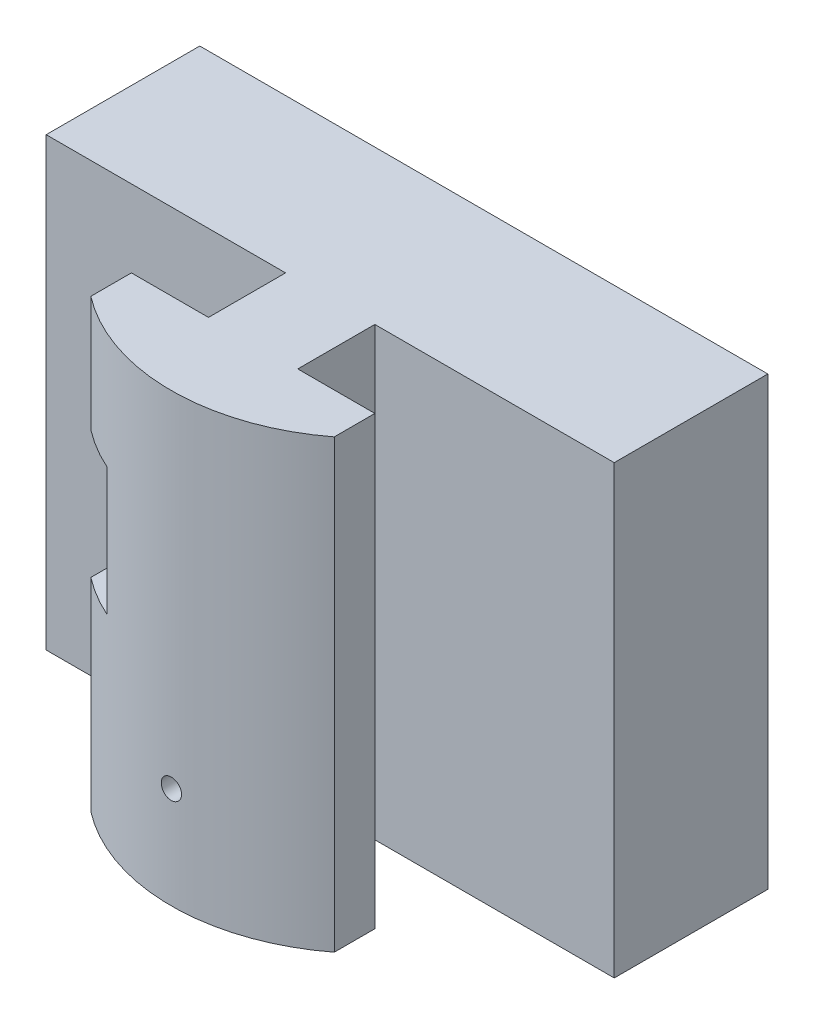
ISO-10303-21;
HEADER;
FILE_DESCRIPTION(('STEP AP214'),'2;1');
FILE_NAME('part.step','',(''),(''),'','','');
FILE_SCHEMA(('AUTOMOTIVE_DESIGN { 1 0 10303 214 1 1 1 1 }'));
ENDSEC;
DATA;
#1=APPLICATION_CONTEXT('core data for automotive mechanical design processes');
#2=APPLICATION_PROTOCOL_DEFINITION('international standard','automotive_design',2000,#1);
#3=PRODUCT_CONTEXT('',#1,'mechanical');
#4=PRODUCT('Part','Part','',(#3));
#5=PRODUCT_RELATED_PRODUCT_CATEGORY('part','',(#4));
#6=PRODUCT_DEFINITION_FORMATION('','',#4);
#7=PRODUCT_DEFINITION_CONTEXT('part definition',#1,'design');
#8=PRODUCT_DEFINITION('design','',#6,#7);
#9=PRODUCT_DEFINITION_SHAPE('','',#8);
#10=(LENGTH_UNIT() NAMED_UNIT(*) SI_UNIT(.MILLI.,.METRE.));
#11=(NAMED_UNIT(*) PLANE_ANGLE_UNIT() SI_UNIT($,.RADIAN.));
#12=(NAMED_UNIT(*) SI_UNIT($,.STERADIAN.) SOLID_ANGLE_UNIT());
#13=UNCERTAINTY_MEASURE_WITH_UNIT(LENGTH_MEASURE(1.E-05),#10,'distance_accuracy_value','');
#14=(GEOMETRIC_REPRESENTATION_CONTEXT(3) GLOBAL_UNCERTAINTY_ASSIGNED_CONTEXT((#13)) GLOBAL_UNIT_ASSIGNED_CONTEXT((#10,
#11,#12)) REPRESENTATION_CONTEXT('',''));
#15=CARTESIAN_POINT('',(0.,0.,0.));
#16=DIRECTION('',(0.,0.,1.));
#17=DIRECTION('',(1.,0.,0.));
#18=AXIS2_PLACEMENT_3D('',#15,#16,#17);
#19=CARTESIAN_POINT('',(116.22223,103.784958,0.));
#20=DIRECTION('',(0.,0.,-1.));
#21=DIRECTION('',(-1.,0.,0.));
#22=AXIS2_PLACEMENT_3D('',#19,#20,#21);
#23=CYLINDRICAL_SURFACE('',#22,0.5);
#24=CARTESIAN_POINT('',(116.22223,104.284958,15.411299780114));
#25=CARTESIAN_POINT('',(116.250295790881,104.284956761582,15.411299610234));
#26=CARTESIAN_POINT('',(116.278381470551,104.28258699731,15.4111784287618));
#27=CARTESIAN_POINT('',(116.333778003503,104.273167168658,15.4107066617587));
#28=CARTESIAN_POINT('',(116.36108790498,104.266111593697,15.4103558061345));
#29=CARTESIAN_POINT('',(116.414122395419,104.247522711383,15.4094644006496));
#30=CARTESIAN_POINT('',(116.43984778619,104.235991690673,15.4089239476735));
#31=CARTESIAN_POINT('',(116.488990869762,104.2087827651,15.407714210784));
#32=CARTESIAN_POINT('',(116.512409104595,104.193105837463,15.4070449572401));
#33=CARTESIAN_POINT('',(116.55630439463,104.158032006366,15.4056521256864));
#34=CARTESIAN_POINT('',(116.57677875671,104.138631734107,15.4049284988443));
#35=CARTESIAN_POINT('',(116.61418215355,104.096668659296,15.4035088986259));
#36=CARTESIAN_POINT('',(116.631111043294,104.074105727451,15.4028129263816));
#37=CARTESIAN_POINT('',(116.660950442217,104.026443594121,15.4015267695578));
#38=CARTESIAN_POINT('',(116.673858837504,104.001343067578,15.4009366406974));
#39=CARTESIAN_POINT('',(116.695277266662,103.949327580961,15.3999293159218));
#40=CARTESIAN_POINT('',(116.703787334717,103.922412634991,15.3995121186626));
#41=CARTESIAN_POINT('',(116.716160395621,103.867557196063,15.3988981468651));
#42=CARTESIAN_POINT('',(116.720027433428,103.839617617658,15.3987011804743));
#43=CARTESIAN_POINT('',(116.723017143376,103.78348525074,15.3985493060341));
#44=CARTESIAN_POINT('',(116.722139853902,103.755292464278,15.3985943960264));
#45=CARTESIAN_POINT('',(116.715669181026,103.699481469268,15.3989213713112));
#46=CARTESIAN_POINT('',(116.710080168484,103.671862752504,15.3992030371417));
#47=CARTESIAN_POINT('',(116.694351474776,103.617956042697,15.3999710722035));
#48=CARTESIAN_POINT('',(116.684211773914,103.591668055416,15.4004574423208));
#49=CARTESIAN_POINT('',(116.659664542588,103.54115494557,15.4015803211614));
#50=CARTESIAN_POINT('',(116.64525501999,103.516930792719,15.4022168999378));
#51=CARTESIAN_POINT('',(116.612578629605,103.471243592693,15.4035683766894));
#52=CARTESIAN_POINT('',(116.594311733658,103.449780565677,15.4042832752362));
#53=CARTESIAN_POINT('',(116.554414463945,103.410199434456,15.4057117915424));
#54=CARTESIAN_POINT('',(116.532780305272,103.392085145083,15.406425406935));
#55=CARTESIAN_POINT('',(116.486775924454,103.359745085237,15.4077701465804));
#56=CARTESIAN_POINT('',(116.462405701622,103.345519315741,15.4084012708124));
#57=CARTESIAN_POINT('',(116.411618737508,103.321360476439,15.4095099289834));
#58=CARTESIAN_POINT('',(116.385201932479,103.311427540408,15.4099874581358));
#59=CARTESIAN_POINT('',(116.331072672771,103.29613882439,15.4107350388489));
#60=CARTESIAN_POINT('',(116.303360228108,103.290783009024,15.4110050920132));
#61=CARTESIAN_POINT('',(116.247459460582,103.284805269549,15.4113070794071));
#62=CARTESIAN_POINT('',(116.219271703327,103.284178068973,15.4113392790469));
#63=CARTESIAN_POINT('',(116.163191346016,103.287661592209,15.4111626352046));
#64=CARTESIAN_POINT('',(116.135298744953,103.29177229983,15.4109537925463));
#65=CARTESIAN_POINT('',(116.080615258897,103.304610584221,15.4103187567625));
#66=CARTESIAN_POINT('',(116.053823806694,103.313335751089,15.4098926770933));
#67=CARTESIAN_POINT('',(116.002085655005,103.335152834956,15.4088711359949));
#68=CARTESIAN_POINT('',(115.977138966489,103.348244777918,15.4082756735588));
#69=CARTESIAN_POINT('',(115.929774263436,103.378437286214,15.4069816878029));
#70=CARTESIAN_POINT('',(115.907358505584,103.395541387794,15.4062830737696));
#71=CARTESIAN_POINT('',(115.865714656967,103.433267525139,15.4048617615876));
#72=CARTESIAN_POINT('',(115.846486587284,103.45388958417,15.4041390632797));
#73=CARTESIAN_POINT('',(115.811746159108,103.498088954329,15.4027502803869));
#74=CARTESIAN_POINT('',(115.796237215068,103.521668951066,15.4020842481852));
#75=CARTESIAN_POINT('',(115.76939861809,103.571101281086,15.4008847271358));
#76=CARTESIAN_POINT('',(115.758068946521,103.596953604238,15.4003512376972));
#77=CARTESIAN_POINT('',(115.739916453304,103.650184095046,15.3994773356696));
#78=CARTESIAN_POINT('',(115.733091456547,103.677561519362,15.3991368299084));
#79=CARTESIAN_POINT('',(115.724134936087,103.733075466054,15.3986870311845));
#80=CARTESIAN_POINT('',(115.722003384585,103.761211983933,15.3985777368523));
#81=CARTESIAN_POINT('',(115.722494525246,103.817411439153,15.3986027197699));
#82=CARTESIAN_POINT('',(115.725111846127,103.845474423716,15.3987367218359));
#83=CARTESIAN_POINT('',(115.735015330439,103.900762002528,15.3992326130762));
#84=CARTESIAN_POINT('',(115.742301502746,103.927986595183,15.3995945026837));
#85=CARTESIAN_POINT('',(115.761334757232,103.980825687198,15.4005053192929));
#86=CARTESIAN_POINT('',(115.773081869109,104.006440175838,15.4010542475398));
#87=CARTESIAN_POINT('',(115.800702633856,104.055333708986,15.4022772566532));
#88=CARTESIAN_POINT('',(115.816576161262,104.078612824472,15.4029513337144));
#89=CARTESIAN_POINT('',(115.852018453767,104.122201666019,15.4043495382018));
#90=CARTESIAN_POINT('',(115.871590975133,104.142508336086,15.4050737160264));
#91=CARTESIAN_POINT('',(115.91387296551,104.179554055076,15.4064901405675));
#92=CARTESIAN_POINT('',(115.936583204813,104.196292225379,15.4071823793872));
#93=CARTESIAN_POINT('',(115.9845142585,104.225733894623,15.4084574142233));
#94=CARTESIAN_POINT('',(116.009737497091,104.238433447171,15.4090401029654));
#95=CARTESIAN_POINT('',(116.061942276453,104.259402218473,15.4100287859528));
#96=CARTESIAN_POINT('',(116.088921698949,104.267676667569,15.4104349886924));
#97=CARTESIAN_POINT('',(116.133762164722,104.277391092866,15.4109175467168));
#98=CARTESIAN_POINT('',(116.151332802101,104.280225057613,15.4110602538954));
#99=CARTESIAN_POINT('',(116.186676298819,104.284008902642,15.4112514243655));
#100=CARTESIAN_POINT('',(116.20444915798,104.284958784589,15.4112998877401));
#101=CARTESIAN_POINT('',(116.22223,104.284958,15.411299780114));
#102=B_SPLINE_CURVE_WITH_KNOTS('',3,(#24,#25,#26,#27,#28,#29,#30,#31,#32,#33,#34,#35,#36,#37,
#38,#39,#40,#41,#42,#43,#44,#45,#46,#47,#48,#49,#50,#51,#52,#53,#54,#55,#56,#57,#58,#59,#60,#61,
#62,#63,#64,#65,#66,#67,#68,#69,#70,#71,#72,#73,#74,#75,#76,#77,#78,#79,#80,#81,#82,#83,#84,#85,
#86,#87,#88,#89,#90,#91,#92,#93,#94,#95,#96,#97,#98,#99,#100,#101),.UNSPECIFIED.,.T.,.F.,(4,2,2,
2,2,2,2,2,2,2,2,2,2,2,2,2,2,2,2,2,2,2,2,2,2,2,2,2,2,2,2,2,2,2,2,2,2,2,4),(0.,0.0841324657087375,
0.16836404807455,0.25255265050805,0.336721426658172,0.420966718965927,0.505215456368168,
0.58950841550987,0.673800719532467,0.758019535604119,0.842237670293314,0.926377765324044,
1.01051822454954,1.09469800246139,1.17887839492577,1.26315410132704,1.34742982889955,
1.43170818253374,1.51598588474599,1.6001695310129,1.68435288961439,1.76849232681471,
1.85263226427893,1.93684664171196,2.021061576115,2.10535353304191,2.18964511417811,
2.27389596476463,2.3581463163286,2.44230143470648,2.52645671306958,2.61061255169859,
2.69476583185319,2.7790050319623,2.86326494915393,2.94760695093811,3.03184904137567,
3.08515049326552,3.13845189809121),.UNSPECIFIED.);
#103=CARTESIAN_POINT('',(116.22223,104.284958,15.411299780114));
#104=VERTEX_POINT('',#103);
#105=EDGE_CURVE('E12',#104,#104,#102,.T.);
#106=ORIENTED_EDGE('',*,*,#105,.F.);
#107=EDGE_LOOP('',(#106));
#108=FACE_BOUND('',#107,.T.);
#109=CARTESIAN_POINT('',(116.22223,103.784958,4.75));
#110=DIRECTION('',(0.,0.,-1.));
#111=DIRECTION('',(0.,1.,0.));
#112=AXIS2_PLACEMENT_3D('',#109,#110,#111);
#113=CIRCLE('',#112,0.5);
#114=CARTESIAN_POINT('',(116.22223,104.284958,4.75));
#115=VERTEX_POINT('',#114);
#116=EDGE_CURVE('E78',#115,#115,#113,.F.);
#117=ORIENTED_EDGE('',*,*,#116,.F.);
#118=EDGE_LOOP('',(#117));
#119=FACE_BOUND('',#118,.T.);
#120=ADVANCED_FACE('F74',(#108,#119),#23,.F.);
#121=CARTESIAN_POINT('',(110.22223,98.7849579999999,1.0896807168857E-13));
#122=DIRECTION('',(-1.,0.,0.));
#123=DIRECTION('',(0.,-1.,0.));
#124=AXIS2_PLACEMENT_3D('',#121,#122,#123);
#125=PLANE('',#124);
#126=DIRECTION('',(0.,0.,-1.));
#127=VECTOR('',#126,1.);
#128=CARTESIAN_POINT('',(110.22223,108.784958,31.3705681));
#129=LINE('',#128,#127);
#130=CARTESIAN_POINT('',(110.22223,108.784958,13.3705681));
#131=VERTEX_POINT('',#130);
#132=CARTESIAN_POINT('',(110.22223,108.784958,11.3705681));
#133=VERTEX_POINT('',#132);
#134=EDGE_CURVE('E313',#131,#133,#129,.T.);
#135=ORIENTED_EDGE('',*,*,#134,.T.);
#136=DIRECTION('',(0.,1.,0.));
#137=VECTOR('',#136,1.);
#138=CARTESIAN_POINT('',(110.22223,98.7849579999999,11.3705681));
#139=LINE('',#138,#137);
#140=CARTESIAN_POINT('',(110.22223,98.7849579999999,11.3705681));
#141=VERTEX_POINT('',#140);
#142=EDGE_CURVE('E381',#141,#133,#139,.T.);
#143=ORIENTED_EDGE('',*,*,#142,.F.);
#144=DIRECTION('',(0.,0.,1.));
#145=VECTOR('',#144,1.);
#146=CARTESIAN_POINT('',(110.22223,98.7849579999999,1.0896807168857E-13));
#147=LINE('',#146,#145);
#148=CARTESIAN_POINT('',(110.22223,98.7849579999999,13.3705681));
#149=VERTEX_POINT('',#148);
#150=EDGE_CURVE('E337',#141,#149,#147,.T.);
#151=ORIENTED_EDGE('',*,*,#150,.T.);
#152=DIRECTION('',(0.,1.,0.));
#153=VECTOR('',#152,1.);
#154=CARTESIAN_POINT('',(110.22223,98.7849579999999,13.3705681));
#155=LINE('',#154,#153);
#156=EDGE_CURVE('E377',#149,#131,#155,.T.);
#157=ORIENTED_EDGE('',*,*,#156,.T.);
#158=EDGE_LOOP('',(#135,#143,#151,#157));
#159=FACE_BOUND('',#158,.T.);
#160=ADVANCED_FACE('F434',(#159),#125,.T.);
#161=CARTESIAN_POINT('',(118.42223,98.7849579999999,1.0896807168857E-13));
#162=DIRECTION('',(-1.,0.,0.));
#163=DIRECTION('',(0.,-1.,0.));
#164=AXIS2_PLACEMENT_3D('',#161,#162,#163);
#165=PLANE('',#164);
#166=DIRECTION('',(0.,0.,1.));
#167=VECTOR('',#166,1.);
#168=CARTESIAN_POINT('',(118.42223,120.784958,1.38097637214182E-13));
#169=LINE('',#168,#167);
#170=CARTESIAN_POINT('',(118.42223,120.784958,7.5705681));
#171=VERTEX_POINT('',#170);
#172=CARTESIAN_POINT('',(118.42223,120.784958,11.3705681));
#173=VERTEX_POINT('',#172);
#174=EDGE_CURVE('E335',#171,#173,#169,.T.);
#175=ORIENTED_EDGE('',*,*,#174,.T.);
#176=DIRECTION('',(0.,1.,0.));
#177=VECTOR('',#176,1.);
#178=CARTESIAN_POINT('',(118.42223,98.7849579999999,11.3705681));
#179=LINE('',#178,#177);
#180=CARTESIAN_POINT('',(118.42223,98.7849579999999,11.3705681));
#181=VERTEX_POINT('',#180);
#182=EDGE_CURVE('E368',#181,#173,#179,.T.);
#183=ORIENTED_EDGE('',*,*,#182,.F.);
#184=DIRECTION('',(0.,0.,1.));
#185=VECTOR('',#184,1.);
#186=CARTESIAN_POINT('',(118.42223,98.7849579999999,1.0896807168857E-13));
#187=LINE('',#186,#185);
#188=CARTESIAN_POINT('',(118.42223,98.7849579999999,7.57056809999997));
#189=VERTEX_POINT('',#188);
#190=EDGE_CURVE('E346',#189,#181,#187,.T.);
#191=ORIENTED_EDGE('',*,*,#190,.F.);
#192=DIRECTION('',(0.,1.,0.));
#193=VECTOR('',#192,1.);
#194=CARTESIAN_POINT('',(118.42223,98.7849579999999,7.57056809999997));
#195=LINE('',#194,#193);
#196=EDGE_CURVE('E83',#189,#171,#195,.T.);
#197=ORIENTED_EDGE('',*,*,#196,.T.);
#198=EDGE_LOOP('',(#175,#183,#191,#197));
#199=FACE_BOUND('',#198,.T.);
#200=ADVANCED_FACE('F460',(#199),#165,.F.);
#201=CARTESIAN_POINT('',(0.,98.7849579999999,11.3705681));
#202=DIRECTION('',(0.,0.,1.));
#203=DIRECTION('',(0.,-1.,0.));
#204=AXIS2_PLACEMENT_3D('',#201,#202,#203);
#205=PLANE('',#204);
#206=DIRECTION('',(1.,0.,0.));
#207=VECTOR('',#206,1.);
#208=CARTESIAN_POINT('',(0.,120.784958,11.3705681));
#209=LINE('',#208,#207);
#210=CARTESIAN_POINT('',(122.22223,120.784958,11.3705681));
#211=VERTEX_POINT('',#210);
#212=EDGE_CURVE('E364',#173,#211,#209,.T.);
#213=ORIENTED_EDGE('',*,*,#212,.T.);
#214=DIRECTION('',(0.,1.,0.));
#215=VECTOR('',#214,1.);
#216=CARTESIAN_POINT('',(122.22223,98.7849579999999,11.3705681));
#217=LINE('',#216,#215);
#218=CARTESIAN_POINT('',(122.22223,98.7849579999999,11.3705681));
#219=VERTEX_POINT('',#218);
#220=EDGE_CURVE('E371',#219,#211,#217,.T.);
#221=ORIENTED_EDGE('',*,*,#220,.F.);
#222=DIRECTION('',(1.,0.,0.));
#223=VECTOR('',#222,1.);
#224=CARTESIAN_POINT('',(0.,98.7849579999999,11.3705681));
#225=LINE('',#224,#223);
#226=EDGE_CURVE('E344',#181,#219,#225,.T.);
#227=ORIENTED_EDGE('',*,*,#226,.F.);
#228=ORIENTED_EDGE('',*,*,#182,.T.);
#229=EDGE_LOOP('',(#213,#221,#227,#228));
#230=FACE_BOUND('',#229,.T.);
#231=ADVANCED_FACE('F463',(#230),#205,.F.);
#232=CARTESIAN_POINT('',(122.22223,98.7849579999999,1.0896807168857E-13));
#233=DIRECTION('',(-1.,0.,0.));
#234=DIRECTION('',(0.,-1.,0.));
#235=AXIS2_PLACEMENT_3D('',#232,#233,#234);
#236=PLANE('',#235);
#237=DIRECTION('',(0.,0.,1.));
#238=VECTOR('',#237,1.);
#239=CARTESIAN_POINT('',(122.22223,120.784958,1.38097637214182E-13));
#240=LINE('',#239,#238);
#241=CARTESIAN_POINT('',(122.22223,120.784958,13.3705681));
#242=VERTEX_POINT('',#241);
#243=EDGE_CURVE('E362',#211,#242,#240,.T.);
#244=ORIENTED_EDGE('',*,*,#243,.T.);
#245=DIRECTION('',(0.,1.,0.));
#246=VECTOR('',#245,1.);
#247=CARTESIAN_POINT('',(122.22223,98.7849579999999,13.3705681));
#248=LINE('',#247,#246);
#249=CARTESIAN_POINT('',(122.22223,98.7849579999999,13.3705681));
#250=VERTEX_POINT('',#249);
#251=EDGE_CURVE('E374',#250,#242,#248,.T.);
#252=ORIENTED_EDGE('',*,*,#251,.F.);
#253=DIRECTION('',(0.,0.,1.));
#254=VECTOR('',#253,1.);
#255=CARTESIAN_POINT('',(122.22223,98.7849579999999,1.0896807168857E-13));
#256=LINE('',#255,#254);
#257=EDGE_CURVE('E342',#219,#250,#256,.T.);
#258=ORIENTED_EDGE('',*,*,#257,.F.);
#259=ORIENTED_EDGE('',*,*,#220,.T.);
#260=EDGE_LOOP('',(#244,#252,#258,#259));
#261=FACE_BOUND('',#260,.T.);
#262=ADVANCED_FACE('F467',(#261),#236,.F.);
#263=CARTESIAN_POINT('',(116.22223,98.7849579999999,5.57056809999998));
#264=DIRECTION('',(0.,1.,0.));
#265=DIRECTION('',(0.,0.,1.));
#266=AXIS2_PLACEMENT_3D('',#263,#264,#265);
#267=CYLINDRICAL_SURFACE('',#266,9.84073168011403);
#268=ORIENTED_EDGE('',*,*,#105,.T.);
#269=EDGE_LOOP('',(#268));
#270=FACE_BOUND('',#269,.T.);
#271=DIRECTION('',(0.,1.,0.));
#272=VECTOR('',#271,1.);
#273=CARTESIAN_POINT('',(112.22223,98.7849579999999,14.5616748171956));
#274=LINE('',#273,#272);
#275=CARTESIAN_POINT('',(112.22223,115.084958,14.5616748171956));
#276=VERTEX_POINT('',#275);
#277=CARTESIAN_POINT('',(112.22223,108.784958,14.5616748171956));
#278=VERTEX_POINT('',#277);
#279=EDGE_CURVE('E324',#276,#278,#274,.F.);
#280=ORIENTED_EDGE('',*,*,#279,.T.);
#281=CARTESIAN_POINT('',(116.22223,108.784958,5.57056809999999));
#282=DIRECTION('',(0.,-1.,0.));
#283=DIRECTION('',(0.,0.,-1.));
#284=AXIS2_PLACEMENT_3D('',#281,#282,#283);
#285=CIRCLE('',#284,9.84073168011403);
#286=EDGE_CURVE('E327',#278,#131,#285,.T.);
#287=ORIENTED_EDGE('',*,*,#286,.T.);
#288=ORIENTED_EDGE('',*,*,#156,.F.);
#289=CARTESIAN_POINT('',(116.22223,98.7849579999999,5.57056809999998));
#290=DIRECTION('',(0.,1.,0.));
#291=DIRECTION('',(0.,0.,1.));
#292=AXIS2_PLACEMENT_3D('',#289,#290,#291);
#293=CIRCLE('',#292,9.84073168011403);
#294=EDGE_CURVE('E340',#250,#149,#293,.F.);
#295=ORIENTED_EDGE('',*,*,#294,.F.);
#296=ORIENTED_EDGE('',*,*,#251,.T.);
#297=CARTESIAN_POINT('',(116.22223,120.784958,5.57056810000001));
#298=DIRECTION('',(0.,1.,0.));
#299=DIRECTION('',(0.,0.,1.));
#300=AXIS2_PLACEMENT_3D('',#297,#298,#299);
#301=CIRCLE('',#300,9.84073168011403);
#302=CARTESIAN_POINT('',(110.22223,120.784958,13.3705681));
#303=VERTEX_POINT('',#302);
#304=EDGE_CURVE('E359',#242,#303,#301,.F.);
#305=ORIENTED_EDGE('',*,*,#304,.T.);
#306=CARTESIAN_POINT('',(110.22223,115.084958,13.3705681));
#307=VERTEX_POINT('',#306);
#308=EDGE_CURVE('E380',#307,#303,#155,.T.);
#309=ORIENTED_EDGE('',*,*,#308,.F.);
#310=CARTESIAN_POINT('',(116.22223,115.084958,5.5705681));
#311=DIRECTION('',(0.,1.,0.));
#312=DIRECTION('',(0.,0.,1.));
#313=AXIS2_PLACEMENT_3D('',#310,#311,#312);
#314=CIRCLE('',#313,9.84073168011403);
#315=EDGE_CURVE('E316',#307,#276,#314,.T.);
#316=ORIENTED_EDGE('',*,*,#315,.T.);
#317=EDGE_LOOP('',(#280,#287,#288,#295,#296,#305,#309,#316));
#318=FACE_BOUND('',#317,.T.);
#319=ADVANCED_FACE('F426',(#270,#318),#267,.T.);
#320=DIRECTION('',(0.,0.,-1.));
#321=VECTOR('',#320,1.);
#322=CARTESIAN_POINT('',(110.22223,115.084958,31.3705681));
#323=LINE('',#322,#321);
#324=CARTESIAN_POINT('',(110.22223,115.084958,11.3705681));
#325=VERTEX_POINT('',#324);
#326=EDGE_CURVE('E98',#307,#325,#323,.T.);
#327=ORIENTED_EDGE('',*,*,#326,.F.);
#328=ORIENTED_EDGE('',*,*,#308,.T.);
#329=DIRECTION('',(0.,0.,1.));
#330=VECTOR('',#329,1.);
#331=CARTESIAN_POINT('',(110.22223,120.784958,1.38097637214182E-13));
#332=LINE('',#331,#330);
#333=CARTESIAN_POINT('',(110.22223,120.784958,11.3705681));
#334=VERTEX_POINT('',#333);
#335=EDGE_CURVE('E356',#334,#303,#332,.T.);
#336=ORIENTED_EDGE('',*,*,#335,.F.);
#337=EDGE_CURVE('E384',#325,#334,#139,.T.);
#338=ORIENTED_EDGE('',*,*,#337,.F.);
#339=EDGE_LOOP('',(#327,#328,#336,#338));
#340=FACE_BOUND('',#339,.T.);
#341=ADVANCED_FACE('F474',(#340),#125,.T.);
#342=CARTESIAN_POINT('',(0.,98.7849579999999,11.3705681));
#343=DIRECTION('',(0.,0.,1.));
#344=DIRECTION('',(0.,-1.,0.));
#345=AXIS2_PLACEMENT_3D('',#342,#343,#344);
#346=PLANE('',#345);
#347=ORIENTED_EDGE('',*,*,#142,.T.);
#348=DIRECTION('',(-1.,0.,0.));
#349=VECTOR('',#348,1.);
#350=CARTESIAN_POINT('',(112.22223,108.784958,11.3705681));
#351=LINE('',#350,#349);
#352=CARTESIAN_POINT('',(112.22223,108.784958,11.3705681));
#353=VERTEX_POINT('',#352);
#354=EDGE_CURVE('E311',#353,#133,#351,.T.);
#355=ORIENTED_EDGE('',*,*,#354,.F.);
#356=DIRECTION('',(0.,-1.,0.));
#357=VECTOR('',#356,1.);
#358=CARTESIAN_POINT('',(112.22223,108.784958,11.3705681));
#359=LINE('',#358,#357);
#360=CARTESIAN_POINT('',(112.22223,115.084958,11.3705681));
#361=VERTEX_POINT('',#360);
#362=EDGE_CURVE('E308',#361,#353,#359,.T.);
#363=ORIENTED_EDGE('',*,*,#362,.F.);
#364=DIRECTION('',(1.,0.,0.));
#365=VECTOR('',#364,1.);
#366=CARTESIAN_POINT('',(112.22223,115.084958,11.3705681));
#367=LINE('',#366,#365);
#368=EDGE_CURVE('E299',#325,#361,#367,.T.);
#369=ORIENTED_EDGE('',*,*,#368,.F.);
#370=ORIENTED_EDGE('',*,*,#337,.T.);
#371=DIRECTION('',(1.,0.,0.));
#372=VECTOR('',#371,1.);
#373=CARTESIAN_POINT('',(0.,120.784958,11.3705681));
#374=LINE('',#373,#372);
#375=CARTESIAN_POINT('',(114.02223,120.784958,11.3705681));
#376=VERTEX_POINT('',#375);
#377=EDGE_CURVE('E352',#334,#376,#374,.T.);
#378=ORIENTED_EDGE('',*,*,#377,.T.);
#379=DIRECTION('',(0.,1.,0.));
#380=VECTOR('',#379,1.);
#381=CARTESIAN_POINT('',(114.02223,98.7849579999999,11.3705681));
#382=LINE('',#381,#380);
#383=CARTESIAN_POINT('',(114.02223,98.7849579999999,11.3705681));
#384=VERTEX_POINT('',#383);
#385=EDGE_CURVE('E385',#384,#376,#382,.T.);
#386=ORIENTED_EDGE('',*,*,#385,.F.);
#387=DIRECTION('',(1.,0.,0.));
#388=VECTOR('',#387,1.);
#389=CARTESIAN_POINT('',(0.,98.7849579999999,11.3705681));
#390=LINE('',#389,#388);
#391=EDGE_CURVE('E334',#141,#384,#390,.T.);
#392=ORIENTED_EDGE('',*,*,#391,.F.);
#393=EDGE_LOOP('',(#347,#355,#363,#369,#370,#378,#386,#392));
#394=FACE_BOUND('',#393,.T.);
#395=ADVANCED_FACE('F524',(#394),#346,.F.);
#396=CARTESIAN_POINT('',(114.02223,98.7849579999999,1.0896807168857E-13));
#397=DIRECTION('',(-1.,0.,0.));
#398=DIRECTION('',(0.,-1.,0.));
#399=AXIS2_PLACEMENT_3D('',#396,#397,#398);
#400=PLANE('',#399);
#401=DIRECTION('',(0.,0.,1.));
#402=VECTOR('',#401,1.);
#403=CARTESIAN_POINT('',(114.02223,120.784958,1.38097637214182E-13));
#404=LINE('',#403,#402);
#405=CARTESIAN_POINT('',(114.02223,120.784958,7.5705681));
#406=VERTEX_POINT('',#405);
#407=EDGE_CURVE('E349',#406,#376,#404,.T.);
#408=ORIENTED_EDGE('',*,*,#407,.F.);
#409=DIRECTION('',(0.,1.,0.));
#410=VECTOR('',#409,1.);
#411=CARTESIAN_POINT('',(114.02223,98.7849579999999,7.57056809999997));
#412=LINE('',#411,#410);
#413=CARTESIAN_POINT('',(114.02223,98.7849579999999,7.57056809999997));
#414=VERTEX_POINT('',#413);
#415=EDGE_CURVE('E348',#414,#406,#412,.T.);
#416=ORIENTED_EDGE('',*,*,#415,.F.);
#417=DIRECTION('',(0.,0.,1.));
#418=VECTOR('',#417,1.);
#419=CARTESIAN_POINT('',(114.02223,98.7849579999999,1.0896807168857E-13));
#420=LINE('',#419,#418);
#421=EDGE_CURVE('E331',#414,#384,#420,.T.);
#422=ORIENTED_EDGE('',*,*,#421,.T.);
#423=ORIENTED_EDGE('',*,*,#385,.T.);
#424=EDGE_LOOP('',(#408,#416,#422,#423));
#425=FACE_BOUND('',#424,.T.);
#426=ADVANCED_FACE('F454',(#425),#400,.T.);
#427=CARTESIAN_POINT('',(0.,98.7849579999999,1.0896807168857E-13));
#428=DIRECTION('',(0.,1.,0.));
#429=DIRECTION('',(0.,0.,1.));
#430=AXIS2_PLACEMENT_3D('',#427,#428,#429);
#431=PLANE('',#430);
#432=DIRECTION('',(0.,0.,-1.));
#433=VECTOR('',#432,1.);
#434=CARTESIAN_POINT('',(126.22223,98.7849579999999,1.09667731731467E-13));
#435=LINE('',#434,#433);
#436=CARTESIAN_POINT('',(126.22223,98.7849579999999,4.75));
#437=VERTEX_POINT('',#436);
#438=CARTESIAN_POINT('',(126.22223,98.7849579999999,2.25));
#439=VERTEX_POINT('',#438);
#440=EDGE_CURVE('E258',#437,#439,#435,.T.);
#441=ORIENTED_EDGE('',*,*,#440,.T.);
#442=DIRECTION('',(1.,0.,0.));
#443=VECTOR('',#442,1.);
#444=CARTESIAN_POINT('',(0.,98.7849579999999,2.25));
#445=LINE('',#444,#443);
#446=CARTESIAN_POINT('',(123.82223086,98.7849579999999,2.25));
#447=VERTEX_POINT('',#446);
#448=EDGE_CURVE('E267',#447,#439,#445,.T.);
#449=ORIENTED_EDGE('',*,*,#448,.F.);
#450=DIRECTION('',(0.,0.,1.));
#451=VECTOR('',#450,1.);
#452=CARTESIAN_POINT('',(123.82223086,98.7849579999999,2.25));
#453=LINE('',#452,#451);
#454=CARTESIAN_POINT('',(123.82223086,98.7849579999999,0.));
#455=VERTEX_POINT('',#454);
#456=EDGE_CURVE('E293',#455,#447,#453,.T.);
#457=ORIENTED_EDGE('',*,*,#456,.F.);
#458=DIRECTION('',(1.,0.,0.));
#459=VECTOR('',#458,1.);
#460=CARTESIAN_POINT('',(102.22223,98.7849579999999,0.));
#461=LINE('',#460,#459);
#462=CARTESIAN_POINT('',(130.22223,98.7849579999999,0.));
#463=VERTEX_POINT('',#462);
#464=EDGE_CURVE('E395',#455,#463,#461,.T.);
#465=ORIENTED_EDGE('',*,*,#464,.T.);
#466=DIRECTION('',(0.,0.,1.));
#467=VECTOR('',#466,1.);
#468=CARTESIAN_POINT('',(130.22223,98.7849579999999,0.));
#469=LINE('',#468,#467);
#470=CARTESIAN_POINT('',(130.22223,98.7849579999999,7.57056809999997));
#471=VERTEX_POINT('',#470);
#472=EDGE_CURVE('E391',#463,#471,#469,.T.);
#473=ORIENTED_EDGE('',*,*,#472,.T.);
#474=DIRECTION('',(1.,0.,0.));
#475=VECTOR('',#474,1.);
#476=CARTESIAN_POINT('',(102.22223,98.7849579999999,7.57056809999997));
#477=LINE('',#476,#475);
#478=EDGE_CURVE('E392',#189,#471,#477,.T.);
#479=ORIENTED_EDGE('',*,*,#478,.F.);
#480=ORIENTED_EDGE('',*,*,#190,.T.);
#481=ORIENTED_EDGE('',*,*,#226,.T.);
#482=ORIENTED_EDGE('',*,*,#257,.T.);
#483=ORIENTED_EDGE('',*,*,#294,.T.);
#484=ORIENTED_EDGE('',*,*,#150,.F.);
#485=ORIENTED_EDGE('',*,*,#391,.T.);
#486=ORIENTED_EDGE('',*,*,#421,.F.);
#487=CARTESIAN_POINT('',(102.22223,98.7849579999999,7.57056809999997));
#488=VERTEX_POINT('',#487);
#489=EDGE_CURVE('E388',#488,#414,#477,.T.);
#490=ORIENTED_EDGE('',*,*,#489,.F.);
#491=DIRECTION('',(0.,0.,1.));
#492=VECTOR('',#491,1.);
#493=CARTESIAN_POINT('',(102.22223,98.7849579999999,0.));
#494=LINE('',#493,#492);
#495=CARTESIAN_POINT('',(102.22223,98.7849579999999,0.));
#496=VERTEX_POINT('',#495);
#497=EDGE_CURVE('E399',#496,#488,#494,.T.);
#498=ORIENTED_EDGE('',*,*,#497,.F.);
#499=CARTESIAN_POINT('',(108.62223057,98.7849579999999,0.));
#500=VERTEX_POINT('',#499);
#501=EDGE_CURVE('E396',#496,#500,#461,.T.);
#502=ORIENTED_EDGE('',*,*,#501,.T.);
#503=DIRECTION('',(0.,0.,-1.));
#504=VECTOR('',#503,1.);
#505=CARTESIAN_POINT('',(108.62223057,98.7849579999999,2.25));
#506=LINE('',#505,#504);
#507=CARTESIAN_POINT('',(108.62223057,98.7849579999999,2.25));
#508=VERTEX_POINT('',#507);
#509=EDGE_CURVE('E287',#508,#500,#506,.T.);
#510=ORIENTED_EDGE('',*,*,#509,.F.);
#511=CARTESIAN_POINT('',(106.22223,98.7849579999999,2.25));
#512=VERTEX_POINT('',#511);
#513=EDGE_CURVE('E265',#512,#508,#445,.T.);
#514=ORIENTED_EDGE('',*,*,#513,.F.);
#515=DIRECTION('',(0.,0.,-1.));
#516=VECTOR('',#515,1.);
#517=CARTESIAN_POINT('',(106.22223,98.7849579999999,1.09667731731467E-13));
#518=LINE('',#517,#516);
#519=CARTESIAN_POINT('',(106.22223,98.7849579999999,4.75));
#520=VERTEX_POINT('',#519);
#521=EDGE_CURVE('E275',#520,#512,#518,.T.);
#522=ORIENTED_EDGE('',*,*,#521,.F.);
#523=DIRECTION('',(1.,0.,0.));
#524=VECTOR('',#523,1.);
#525=CARTESIAN_POINT('',(0.,98.7849579999999,4.75));
#526=LINE('',#525,#524);
#527=EDGE_CURVE('E273',#520,#437,#526,.T.);
#528=ORIENTED_EDGE('',*,*,#527,.T.);
#529=EDGE_LOOP('',(#441,#449,#457,#465,#473,#479,#480,#481,#482,#483,#484,#485,#486,#490,#498,
#502,#510,#514,#522,#528));
#530=FACE_BOUND('',#529,.T.);
#531=ADVANCED_FACE('F451',(#530),#431,.F.);
#532=CARTESIAN_POINT('',(0.,120.784958,1.38097637214182E-13));
#533=DIRECTION('',(0.,1.,0.));
#534=DIRECTION('',(0.,0.,1.));
#535=AXIS2_PLACEMENT_3D('',#532,#533,#534);
#536=PLANE('',#535);
#537=ORIENTED_EDGE('',*,*,#174,.F.);
#538=DIRECTION('',(1.,0.,0.));
#539=VECTOR('',#538,1.);
#540=CARTESIAN_POINT('',(102.22223,120.784958,7.5705681));
#541=LINE('',#540,#539);
#542=CARTESIAN_POINT('',(130.22223,120.784958,7.5705681));
#543=VERTEX_POINT('',#542);
#544=EDGE_CURVE('E330',#171,#543,#541,.T.);
#545=ORIENTED_EDGE('',*,*,#544,.T.);
#546=DIRECTION('',(0.,0.,1.));
#547=VECTOR('',#546,1.);
#548=CARTESIAN_POINT('',(130.22223,120.784958,0.));
#549=LINE('',#548,#547);
#550=CARTESIAN_POINT('',(130.22223,120.784958,0.));
#551=VERTEX_POINT('',#550);
#552=EDGE_CURVE('E406',#551,#543,#549,.T.);
#553=ORIENTED_EDGE('',*,*,#552,.F.);
#554=DIRECTION('',(1.,0.,0.));
#555=VECTOR('',#554,1.);
#556=CARTESIAN_POINT('',(102.22223,120.784958,0.));
#557=LINE('',#556,#555);
#558=CARTESIAN_POINT('',(102.22223,120.784958,0.));
#559=VERTEX_POINT('',#558);
#560=EDGE_CURVE('E409',#559,#551,#557,.T.);
#561=ORIENTED_EDGE('',*,*,#560,.F.);
#562=DIRECTION('',(0.,0.,1.));
#563=VECTOR('',#562,1.);
#564=CARTESIAN_POINT('',(102.22223,120.784958,0.));
#565=LINE('',#564,#563);
#566=CARTESIAN_POINT('',(102.22223,120.784958,7.5705681));
#567=VERTEX_POINT('',#566);
#568=EDGE_CURVE('E411',#559,#567,#565,.T.);
#569=ORIENTED_EDGE('',*,*,#568,.T.);
#570=EDGE_CURVE('E403',#567,#406,#541,.T.);
#571=ORIENTED_EDGE('',*,*,#570,.T.);
#572=ORIENTED_EDGE('',*,*,#407,.T.);
#573=ORIENTED_EDGE('',*,*,#377,.F.);
#574=ORIENTED_EDGE('',*,*,#335,.T.);
#575=ORIENTED_EDGE('',*,*,#304,.F.);
#576=ORIENTED_EDGE('',*,*,#243,.F.);
#577=ORIENTED_EDGE('',*,*,#212,.F.);
#578=EDGE_LOOP('',(#537,#545,#553,#561,#569,#571,#572,#573,#574,#575,#576,#577));
#579=FACE_BOUND('',#578,.T.);
#580=ADVANCED_FACE('F444',(#579),#536,.T.);
#581=CARTESIAN_POINT('',(102.22223,98.7849579999999,0.));
#582=DIRECTION('',(0.,0.,1.));
#583=DIRECTION('',(0.,-1.,0.));
#584=AXIS2_PLACEMENT_3D('',#581,#582,#583);
#585=PLANE('',#584);
#586=ORIENTED_EDGE('',*,*,#464,.F.);
#587=DIRECTION('',(0.,-1.,0.));
#588=VECTOR('',#587,1.);
#589=CARTESIAN_POINT('',(123.82223086,115.784958,0.));
#590=LINE('',#589,#588);
#591=CARTESIAN_POINT('',(123.82223086,115.784958,0.));
#592=VERTEX_POINT('',#591);
#593=EDGE_CURVE('E297',#592,#455,#590,.T.);
#594=ORIENTED_EDGE('',*,*,#593,.F.);
#595=DIRECTION('',(1.,0.,0.));
#596=VECTOR('',#595,1.);
#597=CARTESIAN_POINT('',(123.82223086,115.784958,0.));
#598=LINE('',#597,#596);
#599=CARTESIAN_POINT('',(108.62223057,115.784958,0.));
#600=VERTEX_POINT('',#599);
#601=EDGE_CURVE('E290',#600,#592,#598,.T.);
#602=ORIENTED_EDGE('',*,*,#601,.F.);
#603=DIRECTION('',(0.,-1.,0.));
#604=VECTOR('',#603,1.);
#605=CARTESIAN_POINT('',(108.62223057,115.784958,0.));
#606=LINE('',#605,#604);
#607=EDGE_CURVE('E300',#600,#500,#606,.T.);
#608=ORIENTED_EDGE('',*,*,#607,.T.);
#609=ORIENTED_EDGE('',*,*,#501,.F.);
#610=DIRECTION('',(0.,1.,0.));
#611=VECTOR('',#610,1.);
#612=CARTESIAN_POINT('',(102.22223,98.7849579999999,0.));
#613=LINE('',#612,#611);
#614=EDGE_CURVE('E415',#496,#559,#613,.T.);
#615=ORIENTED_EDGE('',*,*,#614,.T.);
#616=ORIENTED_EDGE('',*,*,#560,.T.);
#617=DIRECTION('',(0.,1.,0.));
#618=VECTOR('',#617,1.);
#619=CARTESIAN_POINT('',(130.22223,98.7849579999999,0.));
#620=LINE('',#619,#618);
#621=EDGE_CURVE('E417',#463,#551,#620,.T.);
#622=ORIENTED_EDGE('',*,*,#621,.F.);
#623=EDGE_LOOP('',(#586,#594,#602,#608,#609,#615,#616,#622));
#624=FACE_BOUND('',#623,.T.);
#625=ADVANCED_FACE('F458',(#624),#585,.F.);
#626=CARTESIAN_POINT('',(130.22223,98.7849579999999,0.));
#627=DIRECTION('',(-1.,0.,0.));
#628=DIRECTION('',(0.,-1.,0.));
#629=AXIS2_PLACEMENT_3D('',#626,#627,#628);
#630=PLANE('',#629);
#631=ORIENTED_EDGE('',*,*,#552,.T.);
#632=DIRECTION('',(0.,1.,0.));
#633=VECTOR('',#632,1.);
#634=CARTESIAN_POINT('',(130.22223,98.7849579999999,7.57056809999997));
#635=LINE('',#634,#633);
#636=EDGE_CURVE('E402',#471,#543,#635,.T.);
#637=ORIENTED_EDGE('',*,*,#636,.F.);
#638=ORIENTED_EDGE('',*,*,#472,.F.);
#639=ORIENTED_EDGE('',*,*,#621,.T.);
#640=EDGE_LOOP('',(#631,#637,#638,#639));
#641=FACE_BOUND('',#640,.T.);
#642=ADVANCED_FACE('F465',(#641),#630,.F.);
#643=CARTESIAN_POINT('',(102.22223,98.7849579999999,0.));
#644=DIRECTION('',(-1.,0.,0.));
#645=DIRECTION('',(0.,-1.,0.));
#646=AXIS2_PLACEMENT_3D('',#643,#644,#645);
#647=PLANE('',#646);
#648=ORIENTED_EDGE('',*,*,#568,.F.);
#649=ORIENTED_EDGE('',*,*,#614,.F.);
#650=ORIENTED_EDGE('',*,*,#497,.T.);
#651=DIRECTION('',(0.,1.,0.));
#652=VECTOR('',#651,1.);
#653=CARTESIAN_POINT('',(102.22223,98.7849579999999,7.57056809999997));
#654=LINE('',#653,#652);
#655=EDGE_CURVE('E353',#488,#567,#654,.T.);
#656=ORIENTED_EDGE('',*,*,#655,.T.);
#657=EDGE_LOOP('',(#648,#649,#650,#656));
#658=FACE_BOUND('',#657,.T.);
#659=ADVANCED_FACE('F515',(#658),#647,.T.);
#660=CARTESIAN_POINT('',(102.22223,98.7849579999999,7.57056809999997));
#661=DIRECTION('',(0.,0.,1.));
#662=DIRECTION('',(0.,-1.,0.));
#663=AXIS2_PLACEMENT_3D('',#660,#661,#662);
#664=PLANE('',#663);
#665=ORIENTED_EDGE('',*,*,#489,.T.);
#666=ORIENTED_EDGE('',*,*,#415,.T.);
#667=ORIENTED_EDGE('',*,*,#570,.F.);
#668=ORIENTED_EDGE('',*,*,#655,.F.);
#669=EDGE_LOOP('',(#665,#666,#667,#668));
#670=FACE_BOUND('',#669,.T.);
#671=ADVANCED_FACE('F76',(#670),#664,.T.);
#672=ORIENTED_EDGE('',*,*,#196,.F.);
#673=ORIENTED_EDGE('',*,*,#478,.T.);
#674=ORIENTED_EDGE('',*,*,#636,.T.);
#675=ORIENTED_EDGE('',*,*,#544,.F.);
#676=EDGE_LOOP('',(#672,#673,#674,#675));
#677=FACE_BOUND('',#676,.T.);
#678=ADVANCED_FACE('F442',(#677),#664,.T.);
#679=CARTESIAN_POINT('',(112.22223,108.784958,31.3705681));
#680=DIRECTION('',(0.,-1.,0.));
#681=DIRECTION('',(0.,0.,-1.));
#682=AXIS2_PLACEMENT_3D('',#679,#680,#681);
#683=PLANE('',#682);
#684=DIRECTION('',(0.,0.,-1.));
#685=VECTOR('',#684,1.);
#686=CARTESIAN_POINT('',(112.22223,108.784958,31.3705681));
#687=LINE('',#686,#685);
#688=EDGE_CURVE('E317',#278,#353,#687,.T.);
#689=ORIENTED_EDGE('',*,*,#688,.T.);
#690=ORIENTED_EDGE('',*,*,#354,.T.);
#691=ORIENTED_EDGE('',*,*,#134,.F.);
#692=ORIENTED_EDGE('',*,*,#286,.F.);
#693=EDGE_LOOP('',(#689,#690,#691,#692));
#694=FACE_BOUND('',#693,.T.);
#695=ADVANCED_FACE('F438',(#694),#683,.F.);
#696=CARTESIAN_POINT('',(112.22223,108.784958,31.3705681));
#697=DIRECTION('',(1.,0.,0.));
#698=DIRECTION('',(0.,0.,-1.));
#699=AXIS2_PLACEMENT_3D('',#696,#697,#698);
#700=PLANE('',#699);
#701=DIRECTION('',(0.,0.,-1.));
#702=VECTOR('',#701,1.);
#703=CARTESIAN_POINT('',(112.22223,115.084958,31.3705681));
#704=LINE('',#703,#702);
#705=EDGE_CURVE('E319',#276,#361,#704,.T.);
#706=ORIENTED_EDGE('',*,*,#705,.T.);
#707=ORIENTED_EDGE('',*,*,#362,.T.);
#708=ORIENTED_EDGE('',*,*,#688,.F.);
#709=ORIENTED_EDGE('',*,*,#279,.F.);
#710=EDGE_LOOP('',(#706,#707,#708,#709));
#711=FACE_BOUND('',#710,.T.);
#712=ADVANCED_FACE('F441',(#711),#700,.F.);
#713=CARTESIAN_POINT('',(112.22223,115.084958,31.3705681));
#714=DIRECTION('',(0.,1.,0.));
#715=DIRECTION('',(0.,0.,1.));
#716=AXIS2_PLACEMENT_3D('',#713,#714,#715);
#717=PLANE('',#716);
#718=ORIENTED_EDGE('',*,*,#326,.T.);
#719=ORIENTED_EDGE('',*,*,#368,.T.);
#720=ORIENTED_EDGE('',*,*,#705,.F.);
#721=ORIENTED_EDGE('',*,*,#315,.F.);
#722=EDGE_LOOP('',(#718,#719,#720,#721));
#723=FACE_BOUND('',#722,.T.);
#724=ADVANCED_FACE('F447',(#723),#717,.F.);
#725=CARTESIAN_POINT('',(123.82223086,115.784958,2.25000000000002));
#726=DIRECTION('',(1.,0.,0.));
#727=DIRECTION('',(0.,1.,0.));
#728=AXIS2_PLACEMENT_3D('',#725,#726,#727);
#729=PLANE('',#728);
#730=ORIENTED_EDGE('',*,*,#456,.T.);
#731=DIRECTION('',(0.,-1.,0.));
#732=VECTOR('',#731,1.);
#733=CARTESIAN_POINT('',(123.82223086,115.784958,2.25000000000002));
#734=LINE('',#733,#732);
#735=CARTESIAN_POINT('',(123.82223086,115.784958,2.25000000000002));
#736=VERTEX_POINT('',#735);
#737=EDGE_CURVE('E292',#736,#447,#734,.T.);
#738=ORIENTED_EDGE('',*,*,#737,.F.);
#739=DIRECTION('',(0.,0.,1.));
#740=VECTOR('',#739,1.);
#741=CARTESIAN_POINT('',(123.82223086,115.784958,2.25000000000002));
#742=LINE('',#741,#740);
#743=EDGE_CURVE('E283',#592,#736,#742,.T.);
#744=ORIENTED_EDGE('',*,*,#743,.F.);
#745=ORIENTED_EDGE('',*,*,#593,.T.);
#746=EDGE_LOOP('',(#730,#738,#744,#745));
#747=FACE_BOUND('',#746,.T.);
#748=ADVANCED_FACE('F436',(#747),#729,.F.);
#749=CARTESIAN_POINT('',(108.62223057,115.784958,2.25000000000002));
#750=DIRECTION('',(-1.,0.,0.));
#751=DIRECTION('',(0.,-1.,0.));
#752=AXIS2_PLACEMENT_3D('',#749,#750,#751);
#753=PLANE('',#752);
#754=ORIENTED_EDGE('',*,*,#509,.T.);
#755=ORIENTED_EDGE('',*,*,#607,.F.);
#756=DIRECTION('',(0.,0.,-1.));
#757=VECTOR('',#756,1.);
#758=CARTESIAN_POINT('',(108.62223057,115.784958,2.25000000000002));
#759=LINE('',#758,#757);
#760=CARTESIAN_POINT('',(108.62223057,115.784958,2.25000000000002));
#761=VERTEX_POINT('',#760);
#762=EDGE_CURVE('E90',#761,#600,#759,.T.);
#763=ORIENTED_EDGE('',*,*,#762,.F.);
#764=DIRECTION('',(0.,-1.,0.));
#765=VECTOR('',#764,1.);
#766=CARTESIAN_POINT('',(108.62223057,115.784958,2.25000000000002));
#767=LINE('',#766,#765);
#768=EDGE_CURVE('E303',#761,#508,#767,.T.);
#769=ORIENTED_EDGE('',*,*,#768,.T.);
#770=EDGE_LOOP('',(#754,#755,#763,#769));
#771=FACE_BOUND('',#770,.T.);
#772=ADVANCED_FACE('F576',(#771),#753,.F.);
#773=CARTESIAN_POINT('',(0.,115.784958,0.));
#774=DIRECTION('',(0.,1.,0.));
#775=DIRECTION('',(0.,0.,1.));
#776=AXIS2_PLACEMENT_3D('',#773,#774,#775);
#777=PLANE('',#776);
#778=ORIENTED_EDGE('',*,*,#743,.T.);
#779=DIRECTION('',(-1.,0.,0.));
#780=VECTOR('',#779,1.);
#781=CARTESIAN_POINT('',(123.82223086,115.784958,2.25000000000002));
#782=LINE('',#781,#780);
#783=EDGE_CURVE('E286',#736,#761,#782,.T.);
#784=ORIENTED_EDGE('',*,*,#783,.T.);
#785=ORIENTED_EDGE('',*,*,#762,.T.);
#786=ORIENTED_EDGE('',*,*,#601,.T.);
#787=EDGE_LOOP('',(#778,#784,#785,#786));
#788=FACE_BOUND('',#787,.T.);
#789=ADVANCED_FACE('F584',(#788),#777,.F.);
#790=CARTESIAN_POINT('',(0.,118.784958,4.75000000000002));
#791=DIRECTION('',(0.,0.,-1.));
#792=DIRECTION('',(0.,1.,0.));
#793=AXIS2_PLACEMENT_3D('',#790,#791,#792);
#794=PLANE('',#793);
#795=ORIENTED_EDGE('',*,*,#527,.F.);
#796=DIRECTION('',(0.,-1.,0.));
#797=VECTOR('',#796,1.);
#798=CARTESIAN_POINT('',(106.22223,118.784958,4.75000000000002));
#799=LINE('',#798,#797);
#800=CARTESIAN_POINT('',(106.22223,118.784958,4.75000000000002));
#801=VERTEX_POINT('',#800);
#802=EDGE_CURVE('E245',#801,#520,#799,.T.);
#803=ORIENTED_EDGE('',*,*,#802,.F.);
#804=DIRECTION('',(1.,0.,0.));
#805=VECTOR('',#804,1.);
#806=CARTESIAN_POINT('',(0.,118.784958,4.75000000000002));
#807=LINE('',#806,#805);
#808=CARTESIAN_POINT('',(126.22223,118.784958,4.75000000000002));
#809=VERTEX_POINT('',#808);
#810=EDGE_CURVE('E238',#801,#809,#807,.T.);
#811=ORIENTED_EDGE('',*,*,#810,.T.);
#812=DIRECTION('',(0.,-1.,0.));
#813=VECTOR('',#812,1.);
#814=CARTESIAN_POINT('',(126.22223,118.784958,4.75000000000002));
#815=LINE('',#814,#813);
#816=EDGE_CURVE('E243',#809,#437,#815,.T.);
#817=ORIENTED_EDGE('',*,*,#816,.T.);
#818=EDGE_LOOP('',(#795,#803,#811,#817));
#819=FACE_BOUND('',#818,.T.);
#820=ORIENTED_EDGE('',*,*,#116,.T.);
#821=EDGE_LOOP('',(#820));
#822=FACE_BOUND('',#821,.T.);
#823=ADVANCED_FACE('F241',(#819,#822),#794,.T.);
#824=CARTESIAN_POINT('',(0.,118.784958,2.25000000000002));
#825=DIRECTION('',(0.,0.,-1.));
#826=DIRECTION('',(0.,1.,0.));
#827=AXIS2_PLACEMENT_3D('',#824,#825,#826);
#828=PLANE('',#827);
#829=ORIENTED_EDGE('',*,*,#448,.T.);
#830=DIRECTION('',(0.,-1.,0.));
#831=VECTOR('',#830,1.);
#832=CARTESIAN_POINT('',(126.22223,118.784958,2.25000000000002));
#833=LINE('',#832,#831);
#834=CARTESIAN_POINT('',(126.22223,118.784958,2.25000000000002));
#835=VERTEX_POINT('',#834);
#836=EDGE_CURVE('E278',#835,#439,#833,.T.);
#837=ORIENTED_EDGE('',*,*,#836,.F.);
#838=DIRECTION('',(1.,0.,0.));
#839=VECTOR('',#838,1.);
#840=CARTESIAN_POINT('',(0.,118.784958,2.25000000000002));
#841=LINE('',#840,#839);
#842=CARTESIAN_POINT('',(106.22223,118.784958,2.25000000000002));
#843=VERTEX_POINT('',#842);
#844=EDGE_CURVE('E260',#843,#835,#841,.T.);
#845=ORIENTED_EDGE('',*,*,#844,.F.);
#846=DIRECTION('',(0.,-1.,0.));
#847=VECTOR('',#846,1.);
#848=CARTESIAN_POINT('',(106.22223,118.784958,2.25000000000002));
#849=LINE('',#848,#847);
#850=EDGE_CURVE('E280',#843,#512,#849,.T.);
#851=ORIENTED_EDGE('',*,*,#850,.T.);
#852=ORIENTED_EDGE('',*,*,#513,.T.);
#853=ORIENTED_EDGE('',*,*,#768,.F.);
#854=ORIENTED_EDGE('',*,*,#783,.F.);
#855=ORIENTED_EDGE('',*,*,#737,.T.);
#856=EDGE_LOOP('',(#829,#837,#845,#851,#852,#853,#854,#855));
#857=FACE_BOUND('',#856,.T.);
#858=ADVANCED_FACE('F597',(#857),#828,.F.);
#859=CARTESIAN_POINT('',(126.22223,118.784958,1.32471076227671E-13));
#860=DIRECTION('',(-1.,0.,0.));
#861=DIRECTION('',(0.,-1.,0.));
#862=AXIS2_PLACEMENT_3D('',#859,#860,#861);
#863=PLANE('',#862);
#864=ORIENTED_EDGE('',*,*,#440,.F.);
#865=ORIENTED_EDGE('',*,*,#816,.F.);
#866=DIRECTION('',(0.,0.,-1.));
#867=VECTOR('',#866,1.);
#868=CARTESIAN_POINT('',(126.22223,118.784958,1.32471076227671E-13));
#869=LINE('',#868,#867);
#870=EDGE_CURVE('E251',#809,#835,#869,.T.);
#871=ORIENTED_EDGE('',*,*,#870,.T.);
#872=ORIENTED_EDGE('',*,*,#836,.T.);
#873=EDGE_LOOP('',(#864,#865,#871,#872));
#874=FACE_BOUND('',#873,.T.);
#875=ADVANCED_FACE('F254',(#874),#863,.T.);
#876=CARTESIAN_POINT('',(106.22223,118.784958,1.32471076227671E-13));
#877=DIRECTION('',(-1.,0.,0.));
#878=DIRECTION('',(0.,-1.,0.));
#879=AXIS2_PLACEMENT_3D('',#876,#877,#878);
#880=PLANE('',#879);
#881=ORIENTED_EDGE('',*,*,#521,.T.);
#882=ORIENTED_EDGE('',*,*,#850,.F.);
#883=DIRECTION('',(0.,0.,-1.));
#884=VECTOR('',#883,1.);
#885=CARTESIAN_POINT('',(106.22223,118.784958,1.32471076227671E-13));
#886=LINE('',#885,#884);
#887=EDGE_CURVE('E250',#801,#843,#886,.T.);
#888=ORIENTED_EDGE('',*,*,#887,.F.);
#889=ORIENTED_EDGE('',*,*,#802,.T.);
#890=EDGE_LOOP('',(#881,#882,#888,#889));
#891=FACE_BOUND('',#890,.T.);
#892=ADVANCED_FACE('F611',(#891),#880,.F.);
#893=CARTESIAN_POINT('',(0.,118.784958,1.32471076227671E-13));
#894=DIRECTION('',(0.,-1.,0.));
#895=DIRECTION('',(0.,0.,-1.));
#896=AXIS2_PLACEMENT_3D('',#893,#894,#895);
#897=PLANE('',#896);
#898=ORIENTED_EDGE('',*,*,#870,.F.);
#899=ORIENTED_EDGE('',*,*,#810,.F.);
#900=ORIENTED_EDGE('',*,*,#887,.T.);
#901=ORIENTED_EDGE('',*,*,#844,.T.);
#902=EDGE_LOOP('',(#898,#899,#900,#901));
#903=FACE_BOUND('',#902,.T.);
#904=ADVANCED_FACE('F263',(#903),#897,.T.);
#905=CLOSED_SHELL('',(#120,#160,#200,#231,#262,#319,#341,#395,#426,#531,#580,#625,#642,#659,
#671,#678,#695,#712,#724,#748,#772,#789,#823,#858,#875,#892,#904));
#906=MANIFOLD_SOLID_BREP('B2',#905);
#907=ADVANCED_BREP_SHAPE_REPRESENTATION('',(#18,#906),#14);
#908=SHAPE_DEFINITION_REPRESENTATION(#9,#907);
ENDSEC;
END-ISO-10303-21;
